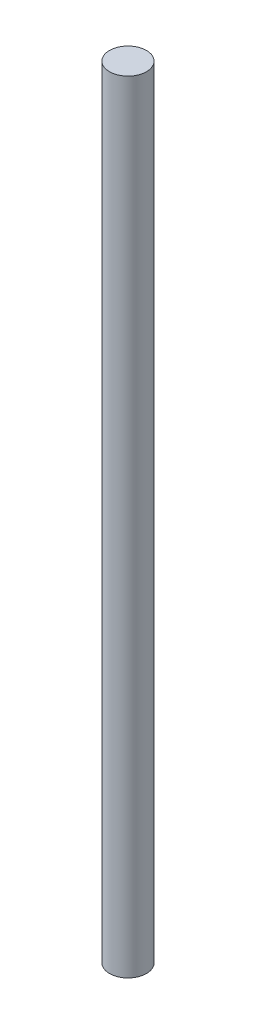
ISO-10303-21;
HEADER;
FILE_DESCRIPTION(('STEP AP214'),'2;1');
FILE_NAME('part.step','',(''),(''),'','','');
FILE_SCHEMA(('AUTOMOTIVE_DESIGN { 1 0 10303 214 1 1 1 1 }'));
ENDSEC;
DATA;
#1=APPLICATION_CONTEXT('core data for automotive mechanical design processes');
#2=APPLICATION_PROTOCOL_DEFINITION('international standard','automotive_design',2000,#1);
#3=PRODUCT_CONTEXT('',#1,'mechanical');
#4=PRODUCT('Part','Part','',(#3));
#5=PRODUCT_RELATED_PRODUCT_CATEGORY('part','',(#4));
#6=PRODUCT_DEFINITION_FORMATION('','',#4);
#7=PRODUCT_DEFINITION_CONTEXT('part definition',#1,'design');
#8=PRODUCT_DEFINITION('design','',#6,#7);
#9=PRODUCT_DEFINITION_SHAPE('','',#8);
#10=(LENGTH_UNIT() NAMED_UNIT(*) SI_UNIT(.MILLI.,.METRE.));
#11=(NAMED_UNIT(*) PLANE_ANGLE_UNIT() SI_UNIT($,.RADIAN.));
#12=(NAMED_UNIT(*) SI_UNIT($,.STERADIAN.) SOLID_ANGLE_UNIT());
#13=UNCERTAINTY_MEASURE_WITH_UNIT(LENGTH_MEASURE(1.E-05),#10,'distance_accuracy_value','');
#14=(GEOMETRIC_REPRESENTATION_CONTEXT(3) GLOBAL_UNCERTAINTY_ASSIGNED_CONTEXT((#13)) GLOBAL_UNIT_ASSIGNED_CONTEXT((#10,
#11,#12)) REPRESENTATION_CONTEXT('',''));
#15=CARTESIAN_POINT('',(0.,0.,0.));
#16=DIRECTION('',(0.,0.,1.));
#17=DIRECTION('',(1.,0.,0.));
#18=AXIS2_PLACEMENT_3D('',#15,#16,#17);
#19=CARTESIAN_POINT('',(0.,100.,0.));
#20=DIRECTION('',(0.,-1.,0.));
#21=DIRECTION('',(0.,0.,-1.));
#22=AXIS2_PLACEMENT_3D('',#19,#20,#21);
#23=CYLINDRICAL_SURFACE('',#22,2.36325);
#24=CARTESIAN_POINT('',(0.,100.,0.));
#25=DIRECTION('',(0.,1.,0.));
#26=DIRECTION('',(0.,0.,1.));
#27=AXIS2_PLACEMENT_3D('',#24,#25,#26);
#28=CIRCLE('',#27,2.36325);
#29=CARTESIAN_POINT('',(0.,100.,2.36325));
#30=VERTEX_POINT('',#29);
#31=EDGE_CURVE('E10',#30,#30,#28,.T.);
#32=ORIENTED_EDGE('',*,*,#31,.F.);
#33=EDGE_LOOP('',(#32));
#34=FACE_BOUND('',#33,.T.);
#35=CARTESIAN_POINT('',(0.,0.,0.));
#36=DIRECTION('',(0.,1.,0.));
#37=DIRECTION('',(0.,0.,1.));
#38=AXIS2_PLACEMENT_3D('',#35,#36,#37);
#39=CIRCLE('',#38,2.36325);
#40=CARTESIAN_POINT('',(0.,0.,2.36325));
#41=VERTEX_POINT('',#40);
#42=EDGE_CURVE('E34',#41,#41,#39,.T.);
#43=ORIENTED_EDGE('',*,*,#42,.T.);
#44=EDGE_LOOP('',(#43));
#45=FACE_BOUND('',#44,.T.);
#46=ADVANCED_FACE('F31',(#34,#45),#23,.T.);
#47=CARTESIAN_POINT('',(0.,100.,0.));
#48=DIRECTION('',(0.,1.,0.));
#49=DIRECTION('',(0.,0.,1.));
#50=AXIS2_PLACEMENT_3D('',#47,#48,#49);
#51=PLANE('',#50);
#52=ORIENTED_EDGE('',*,*,#31,.T.);
#53=EDGE_LOOP('',(#52));
#54=FACE_BOUND('',#53,.T.);
#55=ADVANCED_FACE('F46',(#54),#51,.T.);
#56=CARTESIAN_POINT('',(0.,0.,0.));
#57=DIRECTION('',(0.,1.,0.));
#58=DIRECTION('',(0.,0.,1.));
#59=AXIS2_PLACEMENT_3D('',#56,#57,#58);
#60=PLANE('',#59);
#61=ORIENTED_EDGE('',*,*,#42,.F.);
#62=EDGE_LOOP('',(#61));
#63=FACE_BOUND('',#62,.T.);
#64=ADVANCED_FACE('F44',(#63),#60,.F.);
#65=CLOSED_SHELL('',(#46,#55,#64));
#66=MANIFOLD_SOLID_BREP('B2',#65);
#67=ADVANCED_BREP_SHAPE_REPRESENTATION('',(#18,#66),#14);
#68=SHAPE_DEFINITION_REPRESENTATION(#9,#67);
ENDSEC;
END-ISO-10303-21;
